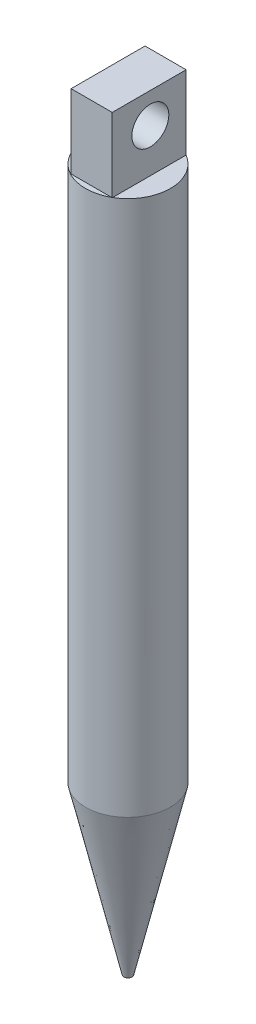
ISO-10303-21;
HEADER;
FILE_DESCRIPTION(('STEP AP214'),'2;1');
FILE_NAME('part.step','',(''),(''),'','','');
FILE_SCHEMA(('AUTOMOTIVE_DESIGN { 1 0 10303 214 1 1 1 1 }'));
ENDSEC;
DATA;
#1=APPLICATION_CONTEXT('core data for automotive mechanical design processes');
#2=APPLICATION_PROTOCOL_DEFINITION('international standard','automotive_design',2000,#1);
#3=PRODUCT_CONTEXT('',#1,'mechanical');
#4=PRODUCT('Part','Part','',(#3));
#5=PRODUCT_RELATED_PRODUCT_CATEGORY('part','',(#4));
#6=PRODUCT_DEFINITION_FORMATION('','',#4);
#7=PRODUCT_DEFINITION_CONTEXT('part definition',#1,'design');
#8=PRODUCT_DEFINITION('design','',#6,#7);
#9=PRODUCT_DEFINITION_SHAPE('','',#8);
#10=(LENGTH_UNIT() NAMED_UNIT(*) SI_UNIT(.MILLI.,.METRE.));
#11=(NAMED_UNIT(*) PLANE_ANGLE_UNIT() SI_UNIT($,.RADIAN.));
#12=(NAMED_UNIT(*) SI_UNIT($,.STERADIAN.) SOLID_ANGLE_UNIT());
#13=UNCERTAINTY_MEASURE_WITH_UNIT(LENGTH_MEASURE(1.E-05),#10,'distance_accuracy_value','');
#14=(GEOMETRIC_REPRESENTATION_CONTEXT(3) GLOBAL_UNCERTAINTY_ASSIGNED_CONTEXT((#13)) GLOBAL_UNIT_ASSIGNED_CONTEXT((#10,
#11,#12)) REPRESENTATION_CONTEXT('',''));
#15=CARTESIAN_POINT('',(0.,0.,0.));
#16=DIRECTION('',(0.,0.,1.));
#17=DIRECTION('',(1.,0.,0.));
#18=AXIS2_PLACEMENT_3D('',#15,#16,#17);
#19=CARTESIAN_POINT('',(-2.13739498432602,-5.30033333333333,8.));
#20=DIRECTION('',(0.,1.,0.));
#21=DIRECTION('',(0.,0.,1.));
#22=AXIS2_PLACEMENT_3D('',#19,#20,#21);
#23=PLANE('',#22);
#24=CARTESIAN_POINT('',(0.,-5.30033333333333,3.98343503850757));
#25=DIRECTION('',(0.,-1.,0.));
#26=DIRECTION('',(0.,0.,-1.));
#27=AXIS2_PLACEMENT_3D('',#24,#25,#26);
#28=CIRCLE('',#27,4.5978694128477);
#29=CARTESIAN_POINT('',(2.29622482165632,-5.30033333333333,0.));
#30=VERTEX_POINT('',#29);
#31=CARTESIAN_POINT('',(2.31260501567398,-5.30033333333333,0.00948723071240651));
#32=VERTEX_POINT('',#31);
#33=EDGE_CURVE('E42',#30,#32,#28,.T.);
#34=ORIENTED_EDGE('',*,*,#33,.F.);
#35=DIRECTION('',(1.,0.,0.));
#36=VECTOR('',#35,1.);
#37=CARTESIAN_POINT('',(-2.13739498432602,-5.30033333333333,0.));
#38=LINE('',#37,#36);
#39=CARTESIAN_POINT('',(2.31260501567398,-5.30033333333333,0.));
#40=VERTEX_POINT('',#39);
#41=EDGE_CURVE('E127',#30,#40,#38,.T.);
#42=ORIENTED_EDGE('',*,*,#41,.T.);
#43=DIRECTION('',(0.,0.,-1.));
#44=VECTOR('',#43,1.);
#45=CARTESIAN_POINT('',(2.31260501567398,-5.30033333333333,8.));
#46=LINE('',#45,#44);
#47=EDGE_CURVE('E50',#32,#40,#46,.T.);
#48=ORIENTED_EDGE('',*,*,#47,.F.);
#49=EDGE_LOOP('',(#34,#42,#48));
#50=FACE_BOUND('',#49,.T.);
#51=ADVANCED_FACE('F32',(#50),#23,.F.);
#52=CARTESIAN_POINT('',(-2.13739498432602,2.69966666666667,8.));
#53=DIRECTION('',(1.,0.,0.));
#54=DIRECTION('',(0.,1.,0.));
#55=AXIS2_PLACEMENT_3D('',#52,#53,#54);
#56=PLANE('',#55);
#57=CARTESIAN_POINT('',(-2.13739498432602,-0.589342017035122,3.87570666961495));
#58=DIRECTION('',(1.,0.,0.));
#59=DIRECTION('',(0.,1.,0.));
#60=AXIS2_PLACEMENT_3D('',#57,#58,#59);
#61=CIRCLE('',#60,2.);
#62=CARTESIAN_POINT('',(-2.13739498432602,1.41065798296488,3.87570666961495));
#63=VERTEX_POINT('',#62);
#64=EDGE_CURVE('E108',#63,#63,#61,.T.);
#65=ORIENTED_EDGE('',*,*,#64,.T.);
#66=EDGE_LOOP('',(#65));
#67=FACE_BOUND('',#66,.T.);
#68=DIRECTION('',(0.,-1.,0.));
#69=VECTOR('',#68,1.);
#70=CARTESIAN_POINT('',(-2.13739498432602,2.69966666666667,0.));
#71=LINE('',#70,#69);
#72=CARTESIAN_POINT('',(-2.13739498432602,2.69966666666667,0.));
#73=VERTEX_POINT('',#72);
#74=CARTESIAN_POINT('',(-2.13739498432602,-5.30033333333333,0.));
#75=VERTEX_POINT('',#74);
#76=EDGE_CURVE('E124',#73,#75,#71,.T.);
#77=ORIENTED_EDGE('',*,*,#76,.T.);
#78=DIRECTION('',(0.,0.,-1.));
#79=VECTOR('',#78,1.);
#80=CARTESIAN_POINT('',(-2.13739498432602,-5.30033333333333,8.));
#81=LINE('',#80,#79);
#82=CARTESIAN_POINT('',(-2.13739498432602,-5.30033333333333,8.));
#83=VERTEX_POINT('',#82);
#84=EDGE_CURVE('E36',#83,#75,#81,.T.);
#85=ORIENTED_EDGE('',*,*,#84,.F.);
#86=DIRECTION('',(0.,-1.,0.));
#87=VECTOR('',#86,1.);
#88=CARTESIAN_POINT('',(-2.13739498432602,2.69966666666667,8.));
#89=LINE('',#88,#87);
#90=CARTESIAN_POINT('',(-2.13739498432602,2.69966666666667,8.));
#91=VERTEX_POINT('',#90);
#92=EDGE_CURVE('E91',#91,#83,#89,.T.);
#93=ORIENTED_EDGE('',*,*,#92,.F.);
#94=DIRECTION('',(0.,0.,-1.));
#95=VECTOR('',#94,1.);
#96=CARTESIAN_POINT('',(-2.13739498432602,2.69966666666667,8.));
#97=LINE('',#96,#95);
#98=EDGE_CURVE('E123',#91,#73,#97,.T.);
#99=ORIENTED_EDGE('',*,*,#98,.T.);
#100=EDGE_LOOP('',(#77,#85,#93,#99));
#101=FACE_BOUND('',#100,.T.);
#102=ADVANCED_FACE('F34',(#67,#101),#56,.F.);
#103=CARTESIAN_POINT('',(2.31260501567398,-5.30033333333333,7.95738284630273));
#104=VERTEX_POINT('',#103);
#105=CARTESIAN_POINT('',(2.23776876546969,-5.30033333333333,8.));
#106=VERTEX_POINT('',#105);
#107=EDGE_CURVE('E11',#104,#106,#28,.T.);
#108=ORIENTED_EDGE('',*,*,#107,.F.);
#109=CARTESIAN_POINT('',(2.31260501567398,-5.30033333333333,8.));
#110=VERTEX_POINT('',#109);
#111=EDGE_CURVE('E99',#110,#104,#46,.T.);
#112=ORIENTED_EDGE('',*,*,#111,.F.);
#113=DIRECTION('',(1.,0.,0.));
#114=VECTOR('',#113,1.);
#115=CARTESIAN_POINT('',(-2.13739498432602,-5.30033333333333,8.));
#116=LINE('',#115,#114);
#117=EDGE_CURVE('E89',#106,#110,#116,.T.);
#118=ORIENTED_EDGE('',*,*,#117,.F.);
#119=EDGE_LOOP('',(#108,#112,#118));
#120=FACE_BOUND('',#119,.T.);
#121=ADVANCED_FACE('F98',(#120),#23,.F.);
#122=CARTESIAN_POINT('',(2.31260501567398,2.69966666666667,8.));
#123=DIRECTION('',(-1.,0.,0.));
#124=DIRECTION('',(0.,-1.,0.));
#125=AXIS2_PLACEMENT_3D('',#122,#123,#124);
#126=PLANE('',#125);
#127=CARTESIAN_POINT('',(2.31260501567398,-0.589342017035121,3.87570666961495));
#128=DIRECTION('',(1.,0.,0.));
#129=DIRECTION('',(0.,1.,0.));
#130=AXIS2_PLACEMENT_3D('',#127,#128,#129);
#131=CIRCLE('',#130,2.);
#132=CARTESIAN_POINT('',(2.31260501567398,1.41065798296488,3.87570666961495));
#133=VERTEX_POINT('',#132);
#134=EDGE_CURVE('E160',#133,#133,#131,.T.);
#135=ORIENTED_EDGE('',*,*,#134,.F.);
#136=EDGE_LOOP('',(#135));
#137=FACE_BOUND('',#136,.T.);
#138=DIRECTION('',(0.,1.,0.));
#139=VECTOR('',#138,1.);
#140=CARTESIAN_POINT('',(2.31260501567398,2.69966666666667,0.));
#141=LINE('',#140,#139);
#142=CARTESIAN_POINT('',(2.31260501567398,2.69966666666667,0.));
#143=VERTEX_POINT('',#142);
#144=EDGE_CURVE('E129',#40,#143,#141,.T.);
#145=ORIENTED_EDGE('',*,*,#144,.T.);
#146=DIRECTION('',(0.,0.,-1.));
#147=VECTOR('',#146,1.);
#148=CARTESIAN_POINT('',(2.31260501567398,2.69966666666667,8.));
#149=LINE('',#148,#147);
#150=CARTESIAN_POINT('',(2.31260501567398,2.69966666666667,8.));
#151=VERTEX_POINT('',#150);
#152=EDGE_CURVE('E134',#151,#143,#149,.T.);
#153=ORIENTED_EDGE('',*,*,#152,.F.);
#154=DIRECTION('',(0.,1.,0.));
#155=VECTOR('',#154,1.);
#156=CARTESIAN_POINT('',(2.31260501567398,2.69966666666667,8.));
#157=LINE('',#156,#155);
#158=EDGE_CURVE('E96',#110,#151,#157,.T.);
#159=ORIENTED_EDGE('',*,*,#158,.F.);
#160=ORIENTED_EDGE('',*,*,#111,.T.);
#161=EDGE_CURVE('E136',#104,#32,#46,.T.);
#162=ORIENTED_EDGE('',*,*,#161,.T.);
#163=ORIENTED_EDGE('',*,*,#47,.T.);
#164=EDGE_LOOP('',(#145,#153,#159,#160,#162,#163));
#165=FACE_BOUND('',#164,.T.);
#166=ADVANCED_FACE('F138',(#137,#165),#126,.F.);
#167=CARTESIAN_POINT('',(-2.13739498432602,2.69966666666667,8.));
#168=DIRECTION('',(0.,-1.,0.));
#169=DIRECTION('',(0.,0.,-1.));
#170=AXIS2_PLACEMENT_3D('',#167,#168,#169);
#171=PLANE('',#170);
#172=DIRECTION('',(-1.,0.,0.));
#173=VECTOR('',#172,1.);
#174=CARTESIAN_POINT('',(-2.13739498432602,2.69966666666667,0.));
#175=LINE('',#174,#173);
#176=EDGE_CURVE('E118',#143,#73,#175,.T.);
#177=ORIENTED_EDGE('',*,*,#176,.T.);
#178=ORIENTED_EDGE('',*,*,#98,.F.);
#179=DIRECTION('',(-1.,0.,0.));
#180=VECTOR('',#179,1.);
#181=CARTESIAN_POINT('',(-2.13739498432602,2.69966666666667,8.));
#182=LINE('',#181,#180);
#183=EDGE_CURVE('E121',#151,#91,#182,.T.);
#184=ORIENTED_EDGE('',*,*,#183,.F.);
#185=ORIENTED_EDGE('',*,*,#152,.T.);
#186=EDGE_LOOP('',(#177,#178,#184,#185));
#187=FACE_BOUND('',#186,.T.);
#188=ADVANCED_FACE('F148',(#187),#171,.F.);
#189=CARTESIAN_POINT('',(0.,0.,8.));
#190=DIRECTION('',(0.,0.,1.));
#191=DIRECTION('',(1.,0.,0.));
#192=AXIS2_PLACEMENT_3D('',#189,#190,#191);
#193=PLANE('',#192);
#194=ORIENTED_EDGE('',*,*,#92,.T.);
#195=EDGE_CURVE('E87',#83,#106,#116,.T.);
#196=ORIENTED_EDGE('',*,*,#195,.T.);
#197=ORIENTED_EDGE('',*,*,#117,.T.);
#198=ORIENTED_EDGE('',*,*,#158,.T.);
#199=ORIENTED_EDGE('',*,*,#183,.T.);
#200=EDGE_LOOP('',(#194,#196,#197,#198,#199));
#201=FACE_BOUND('',#200,.T.);
#202=ADVANCED_FACE('F88',(#201),#193,.T.);
#203=CARTESIAN_POINT('',(0.,0.,0.));
#204=DIRECTION('',(0.,0.,1.));
#205=DIRECTION('',(1.,0.,0.));
#206=AXIS2_PLACEMENT_3D('',#203,#204,#205);
#207=PLANE('',#206);
#208=ORIENTED_EDGE('',*,*,#76,.F.);
#209=ORIENTED_EDGE('',*,*,#176,.F.);
#210=ORIENTED_EDGE('',*,*,#144,.F.);
#211=ORIENTED_EDGE('',*,*,#41,.F.);
#212=EDGE_CURVE('E105',#75,#30,#38,.T.);
#213=ORIENTED_EDGE('',*,*,#212,.F.);
#214=EDGE_LOOP('',(#208,#209,#210,#211,#213));
#215=FACE_BOUND('',#214,.T.);
#216=ADVANCED_FACE('F145',(#215),#207,.F.);
#217=CARTESIAN_POINT('',(0.,-5.30033333333333,3.98343503850757));
#218=DIRECTION('',(0.,-1.,0.));
#219=DIRECTION('',(0.,0.,-1.));
#220=AXIS2_PLACEMENT_3D('',#217,#218,#219);
#221=PLANE('',#220);
#222=ORIENTED_EDGE('',*,*,#84,.T.);
#223=ORIENTED_EDGE('',*,*,#212,.T.);
#224=EDGE_CURVE('E103',#106,#30,#28,.T.);
#225=ORIENTED_EDGE('',*,*,#224,.F.);
#226=ORIENTED_EDGE('',*,*,#195,.F.);
#227=EDGE_LOOP('',(#222,#223,#225,#226));
#228=FACE_BOUND('',#227,.T.);
#229=ADVANCED_FACE('F104',(#228),#221,.F.);
#230=CARTESIAN_POINT('',(0.,-63.3003333333333,3.98343503850757));
#231=DIRECTION('',(0.,1.,0.));
#232=DIRECTION('',(0.,0.,1.));
#233=AXIS2_PLACEMENT_3D('',#230,#231,#232);
#234=CYLINDRICAL_SURFACE('',#233,4.5978694128477);
#235=CARTESIAN_POINT('',(0.,-63.3003333333333,3.98343503850757));
#236=DIRECTION('',(0.,-1.,0.));
#237=DIRECTION('',(0.,0.,-1.));
#238=AXIS2_PLACEMENT_3D('',#235,#236,#237);
#239=CIRCLE('',#238,4.5978694128477);
#240=CARTESIAN_POINT('',(0.,-63.3003333333333,-0.614434374340129));
#241=VERTEX_POINT('',#240);
#242=EDGE_CURVE('E114',#241,#241,#239,.T.);
#243=ORIENTED_EDGE('',*,*,#242,.F.);
#244=EDGE_LOOP('',(#243));
#245=FACE_BOUND('',#244,.T.);
#246=ORIENTED_EDGE('',*,*,#33,.T.);
#247=EDGE_CURVE('E43',#32,#104,#28,.T.);
#248=ORIENTED_EDGE('',*,*,#247,.T.);
#249=ORIENTED_EDGE('',*,*,#107,.T.);
#250=ORIENTED_EDGE('',*,*,#224,.T.);
#251=EDGE_LOOP('',(#246,#248,#249,#250));
#252=FACE_BOUND('',#251,.T.);
#253=ADVANCED_FACE('F110',(#245,#252),#234,.T.);
#254=ORIENTED_EDGE('',*,*,#161,.F.);
#255=ORIENTED_EDGE('',*,*,#247,.F.);
#256=EDGE_LOOP('',(#254,#255));
#257=FACE_BOUND('',#256,.T.);
#258=ADVANCED_FACE('F179',(#257),#221,.F.);
#259=CARTESIAN_POINT('',(-15.687394984326,-0.589342017035123,3.87570666961495));
#260=DIRECTION('',(1.,0.,0.));
#261=DIRECTION('',(0.,1.,0.));
#262=AXIS2_PLACEMENT_3D('',#259,#260,#261);
#263=CYLINDRICAL_SURFACE('',#262,2.);
#264=ORIENTED_EDGE('',*,*,#134,.T.);
#265=EDGE_LOOP('',(#264));
#266=FACE_BOUND('',#265,.T.);
#267=ORIENTED_EDGE('',*,*,#64,.F.);
#268=EDGE_LOOP('',(#267));
#269=FACE_BOUND('',#268,.T.);
#270=ADVANCED_FACE('F173',(#266,#269),#263,.F.);
#271=CARTESIAN_POINT('',(0.,-63.3003333333333,3.98343503850757));
#272=DIRECTION('',(0.,1.,0.));
#273=DIRECTION('',(0.,0.,-1.));
#274=AXIS2_PLACEMENT_3D('',#271,#272,#273);
#275=CONICAL_SURFACE('',#274,4.5978694128477,0.226892802759263);
#276=CARTESIAN_POINT('',(0.,-81.3003333333333,3.98343503850757));
#277=DIRECTION('',(0.,-1.,0.));
#278=DIRECTION('',(0.,0.,-1.));
#279=AXIS2_PLACEMENT_3D('',#276,#277,#278);
#280=CIRCLE('',#279,0.442241972587559);
#281=CARTESIAN_POINT('',(0.,-81.3003333333333,3.54119306592001));
#282=VERTEX_POINT('',#281);
#283=EDGE_CURVE('E162',#282,#282,#280,.T.);
#284=CARTESIAN_POINT('',(0.,-81.3003333333333,3.54119306592001));
#285=CARTESIAN_POINT('',(0.,-81.1128333333333,3.49790528008396));
#286=CARTESIAN_POINT('',(0.,-80.9253333333333,3.45461749424792));
#287=CARTESIAN_POINT('',(0.,-80.5503333333333,3.36804192257584));
#288=CARTESIAN_POINT('',(0.,-80.3628333333333,3.32475413673979));
#289=CARTESIAN_POINT('',(0.,-79.9878333333333,3.23817856506771));
#290=CARTESIAN_POINT('',(0.,-79.8003333333333,3.19489077923166));
#291=CARTESIAN_POINT('',(0.,-79.4253333333333,3.10831520755958));
#292=CARTESIAN_POINT('',(0.,-79.2378333333333,3.06502742172353));
#293=CARTESIAN_POINT('',(0.,-78.8628333333333,2.97845185005145));
#294=CARTESIAN_POINT('',(0.,-78.6753333333333,2.93516406421541));
#295=CARTESIAN_POINT('',(0.,-78.3003333333333,2.84858849254332));
#296=CARTESIAN_POINT('',(0.,-78.1128333333333,2.80530070670728));
#297=CARTESIAN_POINT('',(0.,-77.7378333333333,2.71872513503519));
#298=CARTESIAN_POINT('',(0.,-77.5503333333333,2.67543734919915));
#299=CARTESIAN_POINT('',(0.,-77.1753333333333,2.58886177752706));
#300=CARTESIAN_POINT('',(0.,-76.9878333333333,2.54557399169102));
#301=CARTESIAN_POINT('',(0.,-76.6128333333333,2.45899842001893));
#302=CARTESIAN_POINT('',(0.,-76.4253333333333,2.41571063418289));
#303=CARTESIAN_POINT('',(0.,-76.0503333333333,2.3291350625108));
#304=CARTESIAN_POINT('',(0.,-75.8628333333333,2.28584727667476));
#305=CARTESIAN_POINT('',(0.,-75.4878333333333,2.19927170500267));
#306=CARTESIAN_POINT('',(0.,-75.3003333333333,2.15598391916663));
#307=CARTESIAN_POINT('',(0.,-74.9253333333333,2.06940834749454));
#308=CARTESIAN_POINT('',(0.,-74.7378333333333,2.0261205616585));
#309=CARTESIAN_POINT('',(0.,-74.3628333333333,1.93954498998641));
#310=CARTESIAN_POINT('',(0.,-74.1753333333333,1.89625720415037));
#311=CARTESIAN_POINT('',(0.,-73.8003333333333,1.80968163247829));
#312=CARTESIAN_POINT('',(0.,-73.6128333333333,1.76639384664224));
#313=CARTESIAN_POINT('',(0.,-73.2378333333333,1.67981827497015));
#314=CARTESIAN_POINT('',(0.,-73.0503333333333,1.63653048913411));
#315=CARTESIAN_POINT('',(0.,-72.6753333333333,1.54995491746203));
#316=CARTESIAN_POINT('',(0.,-72.4878333333333,1.50666713162598));
#317=CARTESIAN_POINT('',(0.,-72.1128333333333,1.4200915599539));
#318=CARTESIAN_POINT('',(0.,-71.9253333333333,1.37680377411785));
#319=CARTESIAN_POINT('',(0.,-71.5503333333333,1.29022820244577));
#320=CARTESIAN_POINT('',(0.,-71.3628333333333,1.24694041660972));
#321=CARTESIAN_POINT('',(0.,-70.9878333333333,1.16036484493764));
#322=CARTESIAN_POINT('',(0.,-70.8003333333333,1.11707705910159));
#323=CARTESIAN_POINT('',(0.,-70.4253333333333,1.03050148742951));
#324=CARTESIAN_POINT('',(0.,-70.2378333333333,0.987213701593467));
#325=CARTESIAN_POINT('',(0.,-69.8628333333333,0.90063812992138));
#326=CARTESIAN_POINT('',(0.,-69.6753333333333,0.857350344085336));
#327=CARTESIAN_POINT('',(0.,-69.3003333333333,0.770774772413249));
#328=CARTESIAN_POINT('',(0.,-69.1128333333333,0.727486986577207));
#329=CARTESIAN_POINT('',(0.,-68.7378333333333,0.640911414905122));
#330=CARTESIAN_POINT('',(0.,-68.5503333333333,0.597623629069078));
#331=CARTESIAN_POINT('',(0.,-68.1753333333333,0.511048057396991));
#332=CARTESIAN_POINT('',(0.,-67.9878333333333,0.467760271560949));
#333=CARTESIAN_POINT('',(0.,-67.6128333333333,0.381184699888863));
#334=CARTESIAN_POINT('',(0.,-67.4253333333333,0.337896914052819));
#335=CARTESIAN_POINT('',(0.,-67.0503333333333,0.251321342380732));
#336=CARTESIAN_POINT('',(0.,-66.8628333333333,0.20803355654469));
#337=CARTESIAN_POINT('',(0.,-66.4878333333333,0.121457984872604));
#338=CARTESIAN_POINT('',(0.,-66.3003333333333,0.0781701990365604));
#339=CARTESIAN_POINT('',(0.,-65.9253333333333,-0.00840537263552539));
#340=CARTESIAN_POINT('',(0.,-65.7378333333333,-0.0516931584715675));
#341=CARTESIAN_POINT('',(0.,-65.3628333333333,-0.138268730143653));
#342=CARTESIAN_POINT('',(0.,-65.1753333333333,-0.181556515979697));
#343=CARTESIAN_POINT('',(0.,-64.8003333333333,-0.268132087651784));
#344=CARTESIAN_POINT('',(0.,-64.6128333333333,-0.311419873487828));
#345=CARTESIAN_POINT('',(0.,-64.2378333333333,-0.397995445159913));
#346=CARTESIAN_POINT('',(0.,-64.0503333333333,-0.441283230995956));
#347=CARTESIAN_POINT('',(0.,-63.6753333333333,-0.527858802668042));
#348=CARTESIAN_POINT('',(0.,-63.4878333333333,-0.571146588504085));
#349=CARTESIAN_POINT('',(0.,-63.3003333333333,-0.614434374340129));
#350=B_SPLINE_CURVE_WITH_KNOTS('',3,(#284,#285,#286,#287,#288,#289,#290,#291,#292,#293,#294,
#295,#296,#297,#298,#299,#300,#301,#302,#303,#304,#305,#306,#307,#308,#309,#310,#311,#312,#313,
#314,#315,#316,#317,#318,#319,#320,#321,#322,#323,#324,#325,#326,#327,#328,#329,#330,#331,#332,
#333,#334,#335,#336,#337,#338,#339,#340,#341,#342,#343,#344,#345,#346,#347,#348,#349),
.UNSPECIFIED.,.F.,.F.,(4,2,2,2,2,2,2,2,2,2,2,2,2,2,2,2,2,2,2,2,2,2,2,2,2,2,2,2,2,2,2,2,4),(0.,
0.57729606063379,1.15459212126758,1.73188818190136,2.30918424253513,2.88648030316892,
3.4637763638027,4.04107242443649,4.61836848507027,5.19566454570406,5.77296060633783,
6.35025666697162,6.9275527276054,7.50484878823919,8.08214484887297,8.65944090950676,
9.23673697014053,9.81403303077431,10.3913290914081,10.9686251520419,11.5459212126757,
12.1232172733094,12.7005133339432,13.277809394577,13.8551054552108,14.4324015158446,
15.0096975764784,15.5869936371121,16.1642896977459,16.7415857583797,17.3188818190135,
17.8961778796473,18.4734739402811),.UNSPECIFIED.);
#351=EDGE_CURVE('BSEAM170',#282,#241,#350,.T.);
#352=ORIENTED_EDGE('',*,*,#283,.F.);
#353=ORIENTED_EDGE('',*,*,#242,.T.);
#354=ORIENTED_EDGE('',*,*,#351,.T.);
#355=ORIENTED_EDGE('',*,*,#351,.F.);
#356=EDGE_LOOP('',(#352,#354,#353,#355));
#357=FACE_BOUND('',#356,.T.);
#358=ADVANCED_FACE('F170',(#357),#275,.T.);
#359=CARTESIAN_POINT('',(0.,-81.3003333333333,3.98343503850757));
#360=DIRECTION('',(0.,-1.,0.));
#361=DIRECTION('',(0.,0.,-1.));
#362=AXIS2_PLACEMENT_3D('',#359,#360,#361);
#363=PLANE('',#362);
#364=ORIENTED_EDGE('',*,*,#283,.T.);
#365=EDGE_LOOP('',(#364));
#366=FACE_BOUND('',#365,.T.);
#367=ADVANCED_FACE('F168',(#366),#363,.T.);
#368=CLOSED_SHELL('',(#51,#102,#121,#166,#188,#202,#216,#229,#253,#258,#270,#358,#367));
#369=MANIFOLD_SOLID_BREP('B2',#368);
#370=ADVANCED_BREP_SHAPE_REPRESENTATION('',(#18,#369),#14);
#371=SHAPE_DEFINITION_REPRESENTATION(#9,#370);
ENDSEC;
END-ISO-10303-21;
